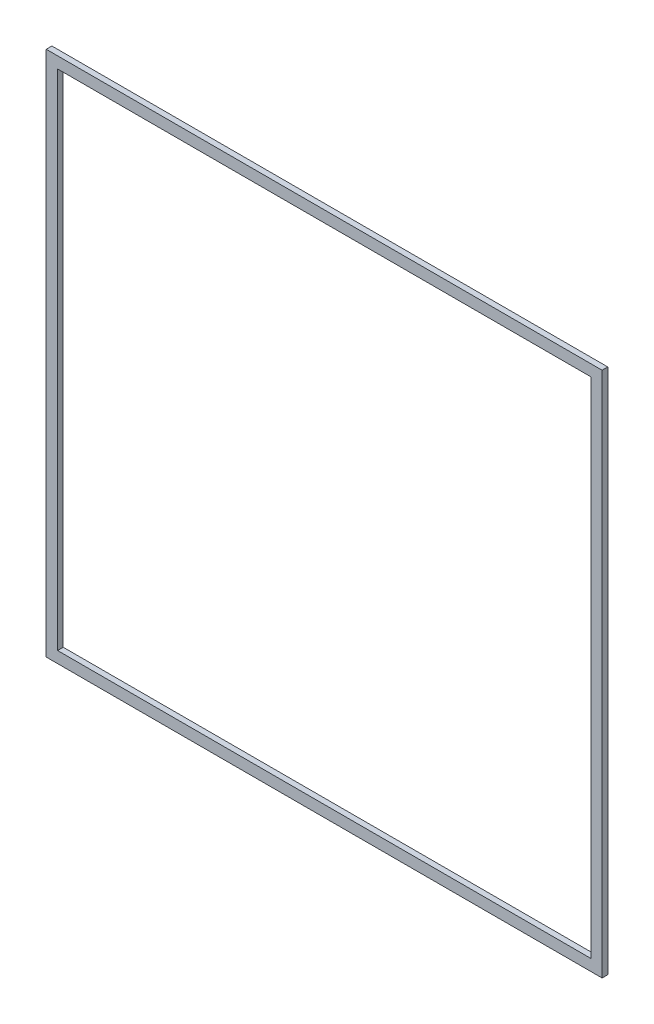
ISO-10303-21;
HEADER;
FILE_DESCRIPTION(('STEP AP214'),'2;1');
FILE_NAME('part.step','',(''),(''),'','','');
FILE_SCHEMA(('AUTOMOTIVE_DESIGN { 1 0 10303 214 1 1 1 1 }'));
ENDSEC;
DATA;
#1=APPLICATION_CONTEXT('core data for automotive mechanical design processes');
#2=APPLICATION_PROTOCOL_DEFINITION('international standard','automotive_design',2000,#1);
#3=PRODUCT_CONTEXT('',#1,'mechanical');
#4=PRODUCT('Part','Part','',(#3));
#5=PRODUCT_RELATED_PRODUCT_CATEGORY('part','',(#4));
#6=PRODUCT_DEFINITION_FORMATION('','',#4);
#7=PRODUCT_DEFINITION_CONTEXT('part definition',#1,'design');
#8=PRODUCT_DEFINITION('design','',#6,#7);
#9=PRODUCT_DEFINITION_SHAPE('','',#8);
#10=(LENGTH_UNIT() NAMED_UNIT(*) SI_UNIT(.MILLI.,.METRE.));
#11=(NAMED_UNIT(*) PLANE_ANGLE_UNIT() SI_UNIT($,.RADIAN.));
#12=(NAMED_UNIT(*) SI_UNIT($,.STERADIAN.) SOLID_ANGLE_UNIT());
#13=UNCERTAINTY_MEASURE_WITH_UNIT(LENGTH_MEASURE(1.E-05),#10,'distance_accuracy_value','');
#14=(GEOMETRIC_REPRESENTATION_CONTEXT(3) GLOBAL_UNCERTAINTY_ASSIGNED_CONTEXT((#13)) GLOBAL_UNIT_ASSIGNED_CONTEXT((#10,
#11,#12)) REPRESENTATION_CONTEXT('',''));
#15=CARTESIAN_POINT('',(0.,0.,0.));
#16=DIRECTION('',(0.,0.,1.));
#17=DIRECTION('',(1.,0.,0.));
#18=AXIS2_PLACEMENT_3D('',#15,#16,#17);
#19=CARTESIAN_POINT('',(0.,0.,-2.5));
#20=DIRECTION('',(0.,0.,1.));
#21=DIRECTION('',(1.,0.,0.));
#22=AXIS2_PLACEMENT_3D('',#19,#20,#21);
#23=PLANE('',#22);
#24=DIRECTION('',(0.,1.,0.));
#25=VECTOR('',#24,1.);
#26=CARTESIAN_POINT('',(-245.,232.,-2.5));
#27=LINE('',#26,#25);
#28=CARTESIAN_POINT('',(-245.,-232.,-2.5));
#29=VERTEX_POINT('',#28);
#30=CARTESIAN_POINT('',(-245.,232.,-2.5));
#31=VERTEX_POINT('',#30);
#32=EDGE_CURVE('E110',#29,#31,#27,.T.);
#33=ORIENTED_EDGE('',*,*,#32,.T.);
#34=DIRECTION('',(1.,0.,0.));
#35=VECTOR('',#34,1.);
#36=CARTESIAN_POINT('',(-245.,232.,-2.5));
#37=LINE('',#36,#35);
#38=CARTESIAN_POINT('',(245.,232.,-2.5));
#39=VERTEX_POINT('',#38);
#40=EDGE_CURVE('E120',#31,#39,#37,.T.);
#41=ORIENTED_EDGE('',*,*,#40,.T.);
#42=DIRECTION('',(0.,1.,0.));
#43=VECTOR('',#42,1.);
#44=CARTESIAN_POINT('',(245.,232.,-2.5));
#45=LINE('',#44,#43);
#46=CARTESIAN_POINT('',(245.,-232.,-2.5));
#47=VERTEX_POINT('',#46);
#48=EDGE_CURVE('E116',#39,#47,#45,.F.);
#49=ORIENTED_EDGE('',*,*,#48,.T.);
#50=DIRECTION('',(1.,0.,0.));
#51=VECTOR('',#50,1.);
#52=CARTESIAN_POINT('',(-245.,-232.,-2.5));
#53=LINE('',#52,#51);
#54=EDGE_CURVE('E112',#47,#29,#53,.F.);
#55=ORIENTED_EDGE('',*,*,#54,.T.);
#56=EDGE_LOOP('',(#33,#41,#49,#55));
#57=FACE_BOUND('',#56,.T.);
#58=DIRECTION('',(0.,1.,0.));
#59=VECTOR('',#58,1.);
#60=CARTESIAN_POINT('',(-235.,222.,-2.5));
#61=LINE('',#60,#59);
#62=CARTESIAN_POINT('',(-235.,-222.,-2.5));
#63=VERTEX_POINT('',#62);
#64=CARTESIAN_POINT('',(-235.,222.,-2.5));
#65=VERTEX_POINT('',#64);
#66=EDGE_CURVE('E80',#63,#65,#61,.T.);
#67=ORIENTED_EDGE('',*,*,#66,.F.);
#68=DIRECTION('',(1.,0.,0.));
#69=VECTOR('',#68,1.);
#70=CARTESIAN_POINT('',(-235.,-222.,-2.5));
#71=LINE('',#70,#69);
#72=CARTESIAN_POINT('',(235.,-222.,-2.5));
#73=VERTEX_POINT('',#72);
#74=EDGE_CURVE('E20',#73,#63,#71,.F.);
#75=ORIENTED_EDGE('',*,*,#74,.F.);
#76=DIRECTION('',(0.,1.,0.));
#77=VECTOR('',#76,1.);
#78=CARTESIAN_POINT('',(235.,222.,-2.5));
#79=LINE('',#78,#77);
#80=CARTESIAN_POINT('',(235.,222.,-2.5));
#81=VERTEX_POINT('',#80);
#82=EDGE_CURVE('E107',#81,#73,#79,.F.);
#83=ORIENTED_EDGE('',*,*,#82,.F.);
#84=DIRECTION('',(1.,0.,0.));
#85=VECTOR('',#84,1.);
#86=CARTESIAN_POINT('',(-235.,222.,-2.5));
#87=LINE('',#86,#85);
#88=EDGE_CURVE('E93',#65,#81,#87,.T.);
#89=ORIENTED_EDGE('',*,*,#88,.F.);
#90=EDGE_LOOP('',(#67,#75,#83,#89));
#91=FACE_BOUND('',#90,.T.);
#92=ADVANCED_FACE('F17',(#57,#91),#23,.F.);
#93=CARTESIAN_POINT('',(-235.,-222.,2.5));
#94=DIRECTION('',(0.,1.,0.));
#95=DIRECTION('',(0.,0.,1.));
#96=AXIS2_PLACEMENT_3D('',#93,#94,#95);
#97=PLANE('',#96);
#98=ORIENTED_EDGE('',*,*,#74,.T.);
#99=DIRECTION('',(0.,0.,-1.));
#100=VECTOR('',#99,1.);
#101=CARTESIAN_POINT('',(-235.,-222.,2.5));
#102=LINE('',#101,#100);
#103=CARTESIAN_POINT('',(-235.,-222.,2.5));
#104=VERTEX_POINT('',#103);
#105=EDGE_CURVE('E86',#104,#63,#102,.T.);
#106=ORIENTED_EDGE('',*,*,#105,.F.);
#107=DIRECTION('',(1.,0.,0.));
#108=VECTOR('',#107,1.);
#109=CARTESIAN_POINT('',(0.,-222.,2.5));
#110=LINE('',#109,#108);
#111=CARTESIAN_POINT('',(235.,-222.,2.5));
#112=VERTEX_POINT('',#111);
#113=EDGE_CURVE('E126',#112,#104,#110,.F.);
#114=ORIENTED_EDGE('',*,*,#113,.F.);
#115=DIRECTION('',(0.,0.,1.));
#116=VECTOR('',#115,1.);
#117=CARTESIAN_POINT('',(235.,-222.,2.5));
#118=LINE('',#117,#116);
#119=EDGE_CURVE('E89',#73,#112,#118,.T.);
#120=ORIENTED_EDGE('',*,*,#119,.F.);
#121=EDGE_LOOP('',(#98,#106,#114,#120));
#122=FACE_BOUND('',#121,.T.);
#123=ADVANCED_FACE('F85',(#122),#97,.T.);
#124=CARTESIAN_POINT('',(-235.,222.,2.5));
#125=DIRECTION('',(1.,0.,0.));
#126=DIRECTION('',(0.,0.,-1.));
#127=AXIS2_PLACEMENT_3D('',#124,#125,#126);
#128=PLANE('',#127);
#129=ORIENTED_EDGE('',*,*,#66,.T.);
#130=DIRECTION('',(0.,0.,-1.));
#131=VECTOR('',#130,1.);
#132=CARTESIAN_POINT('',(-235.,222.,2.5));
#133=LINE('',#132,#131);
#134=CARTESIAN_POINT('',(-235.,222.,2.5));
#135=VERTEX_POINT('',#134);
#136=EDGE_CURVE('E95',#135,#65,#133,.T.);
#137=ORIENTED_EDGE('',*,*,#136,.F.);
#138=DIRECTION('',(0.,1.,0.));
#139=VECTOR('',#138,1.);
#140=CARTESIAN_POINT('',(-235.,0.,2.5));
#141=LINE('',#140,#139);
#142=EDGE_CURVE('E99',#104,#135,#141,.T.);
#143=ORIENTED_EDGE('',*,*,#142,.F.);
#144=ORIENTED_EDGE('',*,*,#105,.T.);
#145=EDGE_LOOP('',(#129,#137,#143,#144));
#146=FACE_BOUND('',#145,.T.);
#147=ADVANCED_FACE('F97',(#146),#128,.T.);
#148=CARTESIAN_POINT('',(-235.,222.,2.5));
#149=DIRECTION('',(0.,-1.,0.));
#150=DIRECTION('',(0.,0.,-1.));
#151=AXIS2_PLACEMENT_3D('',#148,#149,#150);
#152=PLANE('',#151);
#153=ORIENTED_EDGE('',*,*,#88,.T.);
#154=DIRECTION('',(0.,0.,1.));
#155=VECTOR('',#154,1.);
#156=CARTESIAN_POINT('',(235.,222.,2.5));
#157=LINE('',#156,#155);
#158=CARTESIAN_POINT('',(235.,222.,2.5));
#159=VERTEX_POINT('',#158);
#160=EDGE_CURVE('E104',#159,#81,#157,.F.);
#161=ORIENTED_EDGE('',*,*,#160,.F.);
#162=DIRECTION('',(1.,0.,0.));
#163=VECTOR('',#162,1.);
#164=CARTESIAN_POINT('',(0.,222.,2.5));
#165=LINE('',#164,#163);
#166=EDGE_CURVE('E129',#135,#159,#165,.T.);
#167=ORIENTED_EDGE('',*,*,#166,.F.);
#168=ORIENTED_EDGE('',*,*,#136,.T.);
#169=EDGE_LOOP('',(#153,#161,#167,#168));
#170=FACE_BOUND('',#169,.T.);
#171=ADVANCED_FACE('F177',(#170),#152,.T.);
#172=CARTESIAN_POINT('',(235.,222.,2.5));
#173=DIRECTION('',(-1.,0.,0.));
#174=DIRECTION('',(0.,0.,1.));
#175=AXIS2_PLACEMENT_3D('',#172,#173,#174);
#176=PLANE('',#175);
#177=ORIENTED_EDGE('',*,*,#82,.T.);
#178=ORIENTED_EDGE('',*,*,#119,.T.);
#179=DIRECTION('',(0.,1.,0.));
#180=VECTOR('',#179,1.);
#181=CARTESIAN_POINT('',(235.,0.,2.5));
#182=LINE('',#181,#180);
#183=EDGE_CURVE('E132',#159,#112,#182,.F.);
#184=ORIENTED_EDGE('',*,*,#183,.F.);
#185=ORIENTED_EDGE('',*,*,#160,.T.);
#186=EDGE_LOOP('',(#177,#178,#184,#185));
#187=FACE_BOUND('',#186,.T.);
#188=ADVANCED_FACE('F174',(#187),#176,.T.);
#189=CARTESIAN_POINT('',(-245.,232.,2.5));
#190=DIRECTION('',(1.,0.,0.));
#191=DIRECTION('',(0.,0.,-1.));
#192=AXIS2_PLACEMENT_3D('',#189,#190,#191);
#193=PLANE('',#192);
#194=DIRECTION('',(0.,1.,0.));
#195=VECTOR('',#194,1.);
#196=CARTESIAN_POINT('',(-245.,0.,2.5));
#197=LINE('',#196,#195);
#198=CARTESIAN_POINT('',(-245.,232.,2.5));
#199=VERTEX_POINT('',#198);
#200=CARTESIAN_POINT('',(-245.,-232.,2.5));
#201=VERTEX_POINT('',#200);
#202=EDGE_CURVE('E135',#199,#201,#197,.F.);
#203=ORIENTED_EDGE('',*,*,#202,.F.);
#204=DIRECTION('',(0.,0.,-1.));
#205=VECTOR('',#204,1.);
#206=CARTESIAN_POINT('',(-245.,232.,2.5));
#207=LINE('',#206,#205);
#208=EDGE_CURVE('E123',#199,#31,#207,.T.);
#209=ORIENTED_EDGE('',*,*,#208,.T.);
#210=ORIENTED_EDGE('',*,*,#32,.F.);
#211=DIRECTION('',(0.,0.,1.));
#212=VECTOR('',#211,1.);
#213=CARTESIAN_POINT('',(-245.,-232.,2.5));
#214=LINE('',#213,#212);
#215=EDGE_CURVE('E114',#29,#201,#214,.T.);
#216=ORIENTED_EDGE('',*,*,#215,.T.);
#217=EDGE_LOOP('',(#203,#209,#210,#216));
#218=FACE_BOUND('',#217,.T.);
#219=ADVANCED_FACE('F155',(#218),#193,.F.);
#220=CARTESIAN_POINT('',(-245.,-232.,2.5));
#221=DIRECTION('',(0.,1.,0.));
#222=DIRECTION('',(0.,0.,1.));
#223=AXIS2_PLACEMENT_3D('',#220,#221,#222);
#224=PLANE('',#223);
#225=DIRECTION('',(1.,0.,0.));
#226=VECTOR('',#225,1.);
#227=CARTESIAN_POINT('',(0.,-232.,2.5));
#228=LINE('',#227,#226);
#229=CARTESIAN_POINT('',(245.,-232.,2.5));
#230=VERTEX_POINT('',#229);
#231=EDGE_CURVE('E138',#201,#230,#228,.T.);
#232=ORIENTED_EDGE('',*,*,#231,.F.);
#233=ORIENTED_EDGE('',*,*,#215,.F.);
#234=ORIENTED_EDGE('',*,*,#54,.F.);
#235=DIRECTION('',(0.,0.,1.));
#236=VECTOR('',#235,1.);
#237=CARTESIAN_POINT('',(245.,-232.,2.5));
#238=LINE('',#237,#236);
#239=EDGE_CURVE('E118',#47,#230,#238,.T.);
#240=ORIENTED_EDGE('',*,*,#239,.T.);
#241=EDGE_LOOP('',(#232,#233,#234,#240));
#242=FACE_BOUND('',#241,.T.);
#243=ADVANCED_FACE('F150',(#242),#224,.F.);
#244=CARTESIAN_POINT('',(245.,232.,2.5));
#245=DIRECTION('',(-1.,0.,0.));
#246=DIRECTION('',(0.,0.,1.));
#247=AXIS2_PLACEMENT_3D('',#244,#245,#246);
#248=PLANE('',#247);
#249=DIRECTION('',(0.,1.,0.));
#250=VECTOR('',#249,1.);
#251=CARTESIAN_POINT('',(245.,0.,2.5));
#252=LINE('',#251,#250);
#253=CARTESIAN_POINT('',(245.,232.,2.5));
#254=VERTEX_POINT('',#253);
#255=EDGE_CURVE('E26',#230,#254,#252,.T.);
#256=ORIENTED_EDGE('',*,*,#255,.F.);
#257=ORIENTED_EDGE('',*,*,#239,.F.);
#258=ORIENTED_EDGE('',*,*,#48,.F.);
#259=DIRECTION('',(0.,0.,-1.));
#260=VECTOR('',#259,1.);
#261=CARTESIAN_POINT('',(245.,232.,2.5));
#262=LINE('',#261,#260);
#263=EDGE_CURVE('E35',#39,#254,#262,.F.);
#264=ORIENTED_EDGE('',*,*,#263,.T.);
#265=EDGE_LOOP('',(#256,#257,#258,#264));
#266=FACE_BOUND('',#265,.T.);
#267=ADVANCED_FACE('F147',(#266),#248,.F.);
#268=CARTESIAN_POINT('',(-245.,232.,2.5));
#269=DIRECTION('',(0.,-1.,0.));
#270=DIRECTION('',(0.,0.,-1.));
#271=AXIS2_PLACEMENT_3D('',#268,#269,#270);
#272=PLANE('',#271);
#273=DIRECTION('',(1.,0.,0.));
#274=VECTOR('',#273,1.);
#275=CARTESIAN_POINT('',(0.,232.,2.5));
#276=LINE('',#275,#274);
#277=EDGE_CURVE('E11',#254,#199,#276,.F.);
#278=ORIENTED_EDGE('',*,*,#277,.F.);
#279=ORIENTED_EDGE('',*,*,#263,.F.);
#280=ORIENTED_EDGE('',*,*,#40,.F.);
#281=ORIENTED_EDGE('',*,*,#208,.F.);
#282=EDGE_LOOP('',(#278,#279,#280,#281));
#283=FACE_BOUND('',#282,.T.);
#284=ADVANCED_FACE('F159',(#283),#272,.F.);
#285=CARTESIAN_POINT('',(0.,0.,2.5));
#286=DIRECTION('',(0.,0.,1.));
#287=DIRECTION('',(1.,0.,0.));
#288=AXIS2_PLACEMENT_3D('',#285,#286,#287);
#289=PLANE('',#288);
#290=ORIENTED_EDGE('',*,*,#255,.T.);
#291=ORIENTED_EDGE('',*,*,#277,.T.);
#292=ORIENTED_EDGE('',*,*,#202,.T.);
#293=ORIENTED_EDGE('',*,*,#231,.T.);
#294=EDGE_LOOP('',(#290,#291,#292,#293));
#295=FACE_BOUND('',#294,.T.);
#296=ORIENTED_EDGE('',*,*,#166,.T.);
#297=ORIENTED_EDGE('',*,*,#183,.T.);
#298=ORIENTED_EDGE('',*,*,#113,.T.);
#299=ORIENTED_EDGE('',*,*,#142,.T.);
#300=EDGE_LOOP('',(#296,#297,#298,#299));
#301=FACE_BOUND('',#300,.T.);
#302=ADVANCED_FACE('F143',(#295,#301),#289,.T.);
#303=CLOSED_SHELL('',(#92,#123,#147,#171,#188,#219,#243,#267,#284,#302));
#304=MANIFOLD_SOLID_BREP('B1',#303);
#305=ADVANCED_BREP_SHAPE_REPRESENTATION('',(#18,#304),#14);
#306=SHAPE_DEFINITION_REPRESENTATION(#9,#305);
ENDSEC;
END-ISO-10303-21;
